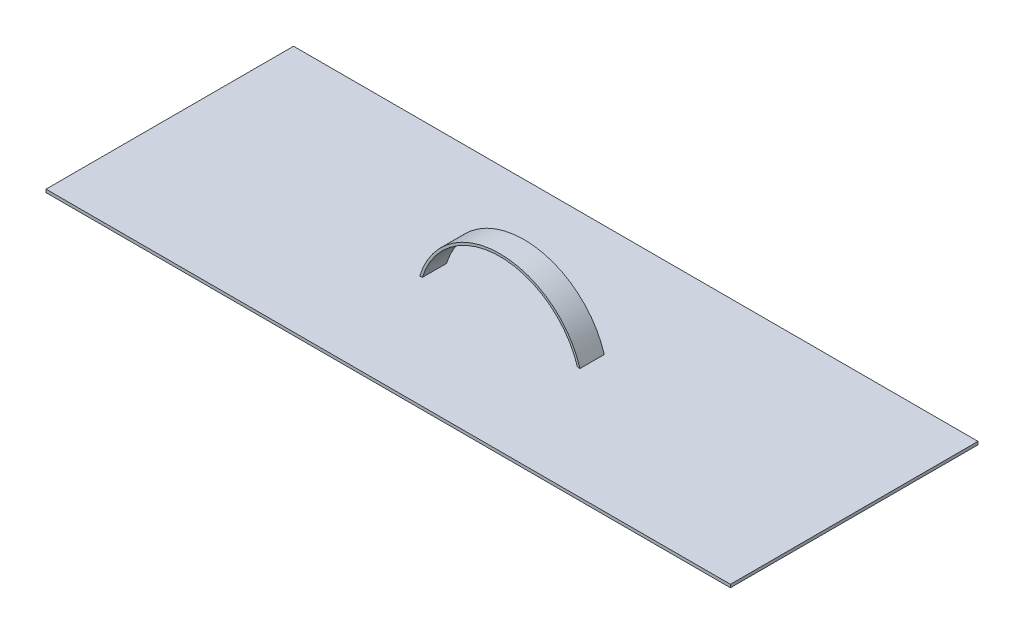
ISO-10303-21;
HEADER;
FILE_DESCRIPTION(('STEP AP214'),'2;1');
FILE_NAME('part.step','',(''),(''),'','','');
FILE_SCHEMA(('AUTOMOTIVE_DESIGN { 1 0 10303 214 1 1 1 1 }'));
ENDSEC;
DATA;
#1=APPLICATION_CONTEXT('core data for automotive mechanical design processes');
#2=APPLICATION_PROTOCOL_DEFINITION('international standard','automotive_design',2000,#1);
#3=PRODUCT_CONTEXT('',#1,'mechanical');
#4=PRODUCT('Part','Part','',(#3));
#5=PRODUCT_RELATED_PRODUCT_CATEGORY('part','',(#4));
#6=PRODUCT_DEFINITION_FORMATION('','',#4);
#7=PRODUCT_DEFINITION_CONTEXT('part definition',#1,'design');
#8=PRODUCT_DEFINITION('design','',#6,#7);
#9=PRODUCT_DEFINITION_SHAPE('','',#8);
#10=(LENGTH_UNIT() NAMED_UNIT(*) SI_UNIT(.MILLI.,.METRE.));
#11=(NAMED_UNIT(*) PLANE_ANGLE_UNIT() SI_UNIT($,.RADIAN.));
#12=(NAMED_UNIT(*) SI_UNIT($,.STERADIAN.) SOLID_ANGLE_UNIT());
#13=UNCERTAINTY_MEASURE_WITH_UNIT(LENGTH_MEASURE(1.E-05),#10,'distance_accuracy_value','');
#14=(GEOMETRIC_REPRESENTATION_CONTEXT(3) GLOBAL_UNCERTAINTY_ASSIGNED_CONTEXT((#13)) GLOBAL_UNIT_ASSIGNED_CONTEXT((#10,
#11,#12)) REPRESENTATION_CONTEXT('',''));
#15=CARTESIAN_POINT('',(0.,0.,0.));
#16=DIRECTION('',(0.,0.,1.));
#17=DIRECTION('',(1.,0.,0.));
#18=AXIS2_PLACEMENT_3D('',#15,#16,#17);
#19=CARTESIAN_POINT('',(0.,2.5,0.));
#20=DIRECTION('',(0.,1.,0.));
#21=DIRECTION('',(0.,0.,1.));
#22=AXIS2_PLACEMENT_3D('',#19,#20,#21);
#23=PLANE('',#22);
#24=DIRECTION('',(0.,0.,-1.));
#25=VECTOR('',#24,1.);
#26=CARTESIAN_POINT('',(85.5226523641972,2.5,35.));
#27=LINE('',#26,#25);
#28=CARTESIAN_POINT('',(85.5226523641972,2.5,35.));
#29=VERTEX_POINT('',#28);
#30=CARTESIAN_POINT('',(85.5226523641972,2.5,25.));
#31=VERTEX_POINT('',#30);
#32=EDGE_CURVE('E253',#29,#31,#27,.T.);
#33=ORIENTED_EDGE('',*,*,#32,.F.);
#34=DIRECTION('',(1.,0.,0.));
#35=VECTOR('',#34,1.);
#36=CARTESIAN_POINT('',(0.,2.5,35.));
#37=LINE('',#36,#35);
#38=CARTESIAN_POINT('',(86.5233290185539,2.5,35.));
#39=VERTEX_POINT('',#38);
#40=EDGE_CURVE('E237',#29,#39,#37,.T.);
#41=ORIENTED_EDGE('',*,*,#40,.T.);
#42=DIRECTION('',(0.,0.,-1.));
#43=VECTOR('',#42,1.);
#44=CARTESIAN_POINT('',(86.5233290185539,2.5,35.));
#45=LINE('',#44,#43);
#46=CARTESIAN_POINT('',(86.5233290185539,2.5,25.));
#47=VERTEX_POINT('',#46);
#48=EDGE_CURVE('E258',#39,#47,#45,.T.);
#49=ORIENTED_EDGE('',*,*,#48,.T.);
#50=DIRECTION('',(1.,0.,0.));
#51=VECTOR('',#50,1.);
#52=CARTESIAN_POINT('',(0.,2.5,25.));
#53=LINE('',#52,#51);
#54=EDGE_CURVE('E248',#31,#47,#53,.T.);
#55=ORIENTED_EDGE('',*,*,#54,.F.);
#56=EDGE_LOOP('',(#33,#41,#49,#55));
#57=FACE_BOUND('',#56,.T.);
#58=DIRECTION('',(-1.,0.,0.));
#59=VECTOR('',#58,1.);
#60=CARTESIAN_POINT('',(251.,2.5,-11.));
#61=LINE('',#60,#59);
#62=CARTESIAN_POINT('',(251.,2.5,-11.));
#63=VERTEX_POINT('',#62);
#64=CARTESIAN_POINT('',(-11.,2.5,-11.));
#65=VERTEX_POINT('',#64);
#66=EDGE_CURVE('E201',#63,#65,#61,.T.);
#67=ORIENTED_EDGE('',*,*,#66,.F.);
#68=DIRECTION('',(0.,0.,-1.));
#69=VECTOR('',#68,1.);
#70=CARTESIAN_POINT('',(251.,2.5,71.));
#71=LINE('',#70,#69);
#72=CARTESIAN_POINT('',(251.,2.5,71.));
#73=VERTEX_POINT('',#72);
#74=EDGE_CURVE('E194',#73,#63,#71,.T.);
#75=ORIENTED_EDGE('',*,*,#74,.F.);
#76=DIRECTION('',(1.,0.,0.));
#77=VECTOR('',#76,1.);
#78=CARTESIAN_POINT('',(-11.,2.5,71.));
#79=LINE('',#78,#77);
#80=CARTESIAN_POINT('',(-11.,2.5,71.));
#81=VERTEX_POINT('',#80);
#82=EDGE_CURVE('E197',#81,#73,#79,.T.);
#83=ORIENTED_EDGE('',*,*,#82,.F.);
#84=DIRECTION('',(0.,0.,1.));
#85=VECTOR('',#84,1.);
#86=CARTESIAN_POINT('',(-11.,2.5,-11.));
#87=LINE('',#86,#85);
#88=EDGE_CURVE('E199',#65,#81,#87,.T.);
#89=ORIENTED_EDGE('',*,*,#88,.F.);
#90=EDGE_LOOP('',(#67,#75,#83,#89));
#91=FACE_BOUND('',#90,.T.);
#92=DIRECTION('',(0.,0.,-1.));
#93=VECTOR('',#92,1.);
#94=CARTESIAN_POINT('',(154.477347635803,2.5,35.));
#95=LINE('',#94,#93);
#96=CARTESIAN_POINT('',(154.477347635803,2.5,25.));
#97=VERTEX_POINT('',#96);
#98=CARTESIAN_POINT('',(154.477347635803,2.5,35.));
#99=VERTEX_POINT('',#98);
#100=EDGE_CURVE('E251',#97,#99,#95,.F.);
#101=ORIENTED_EDGE('',*,*,#100,.F.);
#102=CARTESIAN_POINT('',(153.476670981446,2.5,25.));
#103=VERTEX_POINT('',#102);
#104=EDGE_CURVE('E249',#103,#97,#53,.T.);
#105=ORIENTED_EDGE('',*,*,#104,.F.);
#106=DIRECTION('',(0.,0.,-1.));
#107=VECTOR('',#106,1.);
#108=CARTESIAN_POINT('',(153.476670981446,2.5,35.));
#109=LINE('',#108,#107);
#110=CARTESIAN_POINT('',(153.476670981446,2.5,35.));
#111=VERTEX_POINT('',#110);
#112=EDGE_CURVE('E255',#103,#111,#109,.F.);
#113=ORIENTED_EDGE('',*,*,#112,.T.);
#114=EDGE_CURVE('E245',#111,#99,#37,.T.);
#115=ORIENTED_EDGE('',*,*,#114,.T.);
#116=EDGE_LOOP('',(#101,#105,#113,#115));
#117=FACE_BOUND('',#116,.T.);
#118=ADVANCED_FACE('F33',(#57,#91,#117),#23,.F.);
#119=CARTESIAN_POINT('',(0.,13.75,0.));
#120=DIRECTION('',(0.,-1.,0.));
#121=DIRECTION('',(0.,0.,-1.));
#122=AXIS2_PLACEMENT_3D('',#119,#120,#121);
#123=PLANE('',#122);
#124=DIRECTION('',(0.,0.,-1.));
#125=VECTOR('',#124,1.);
#126=CARTESIAN_POINT('',(153.018933962198,13.75,35.));
#127=LINE('',#126,#125);
#128=CARTESIAN_POINT('',(153.018933962198,13.75,35.));
#129=VERTEX_POINT('',#128);
#130=CARTESIAN_POINT('',(153.018933962198,13.75,25.));
#131=VERTEX_POINT('',#130);
#132=EDGE_CURVE('E169',#129,#131,#127,.T.);
#133=ORIENTED_EDGE('',*,*,#132,.F.);
#134=DIRECTION('',(-1.,0.,0.));
#135=VECTOR('',#134,1.);
#136=CARTESIAN_POINT('',(0.,13.75,35.));
#137=LINE('',#136,#135);
#138=CARTESIAN_POINT('',(151.972644557496,13.75,35.));
#139=VERTEX_POINT('',#138);
#140=EDGE_CURVE('E160',#129,#139,#137,.T.);
#141=ORIENTED_EDGE('',*,*,#140,.T.);
#142=DIRECTION('',(0.,0.,-1.));
#143=VECTOR('',#142,1.);
#144=CARTESIAN_POINT('',(151.972644557496,13.75,35.));
#145=LINE('',#144,#143);
#146=CARTESIAN_POINT('',(151.972644557496,13.75,25.));
#147=VERTEX_POINT('',#146);
#148=EDGE_CURVE('E143',#139,#147,#145,.T.);
#149=ORIENTED_EDGE('',*,*,#148,.T.);
#150=DIRECTION('',(-1.,0.,0.));
#151=VECTOR('',#150,1.);
#152=CARTESIAN_POINT('',(0.,13.75,25.));
#153=LINE('',#152,#151);
#154=EDGE_CURVE('E154',#131,#147,#153,.T.);
#155=ORIENTED_EDGE('',*,*,#154,.F.);
#156=EDGE_LOOP('',(#133,#141,#149,#155));
#157=FACE_BOUND('',#156,.T.);
#158=DIRECTION('',(0.,0.,1.));
#159=VECTOR('',#158,1.);
#160=CARTESIAN_POINT('',(-21.,13.75,81.));
#161=LINE('',#160,#159);
#162=CARTESIAN_POINT('',(-21.,13.75,-21.));
#163=VERTEX_POINT('',#162);
#164=CARTESIAN_POINT('',(-21.,13.75,81.));
#165=VERTEX_POINT('',#164);
#166=EDGE_CURVE('E229',#163,#165,#161,.T.);
#167=ORIENTED_EDGE('',*,*,#166,.T.);
#168=DIRECTION('',(1.,0.,0.));
#169=VECTOR('',#168,1.);
#170=CARTESIAN_POINT('',(-21.,13.75,81.));
#171=LINE('',#170,#169);
#172=CARTESIAN_POINT('',(261.,13.75,81.));
#173=VERTEX_POINT('',#172);
#174=EDGE_CURVE('E241',#165,#173,#171,.T.);
#175=ORIENTED_EDGE('',*,*,#174,.T.);
#176=DIRECTION('',(0.,0.,-1.));
#177=VECTOR('',#176,1.);
#178=CARTESIAN_POINT('',(261.,13.75,81.));
#179=LINE('',#178,#177);
#180=CARTESIAN_POINT('',(261.,13.75,-21.));
#181=VERTEX_POINT('',#180);
#182=EDGE_CURVE('E239',#173,#181,#179,.T.);
#183=ORIENTED_EDGE('',*,*,#182,.T.);
#184=DIRECTION('',(-1.,0.,0.));
#185=VECTOR('',#184,1.);
#186=CARTESIAN_POINT('',(-21.,13.75,-21.));
#187=LINE('',#186,#185);
#188=EDGE_CURVE('E226',#181,#163,#187,.T.);
#189=ORIENTED_EDGE('',*,*,#188,.T.);
#190=EDGE_LOOP('',(#167,#175,#183,#189));
#191=FACE_BOUND('',#190,.T.);
#192=DIRECTION('',(0.,0.,-1.));
#193=VECTOR('',#192,1.);
#194=CARTESIAN_POINT('',(86.9810660378019,13.75,35.));
#195=LINE('',#194,#193);
#196=CARTESIAN_POINT('',(86.9810660378019,13.75,25.));
#197=VERTEX_POINT('',#196);
#198=CARTESIAN_POINT('',(86.9810660378019,13.75,35.));
#199=VERTEX_POINT('',#198);
#200=EDGE_CURVE('E11',#197,#199,#195,.F.);
#201=ORIENTED_EDGE('',*,*,#200,.F.);
#202=CARTESIAN_POINT('',(88.0273554425037,13.75,25.));
#203=VERTEX_POINT('',#202);
#204=EDGE_CURVE('E174',#203,#197,#153,.T.);
#205=ORIENTED_EDGE('',*,*,#204,.F.);
#206=DIRECTION('',(0.,0.,-1.));
#207=VECTOR('',#206,1.);
#208=CARTESIAN_POINT('',(88.0273554425037,13.75,35.));
#209=LINE('',#208,#207);
#210=CARTESIAN_POINT('',(88.0273554425037,13.75,35.));
#211=VERTEX_POINT('',#210);
#212=EDGE_CURVE('E171',#203,#211,#209,.F.);
#213=ORIENTED_EDGE('',*,*,#212,.T.);
#214=EDGE_CURVE('E41',#211,#199,#137,.T.);
#215=ORIENTED_EDGE('',*,*,#214,.T.);
#216=EDGE_LOOP('',(#201,#205,#213,#215));
#217=FACE_BOUND('',#216,.T.);
#218=ADVANCED_FACE('F167',(#157,#191,#217),#123,.F.);
#219=CARTESIAN_POINT('',(251.,12.5,-11.));
#220=DIRECTION('',(0.,0.,1.));
#221=DIRECTION('',(1.,0.,0.));
#222=AXIS2_PLACEMENT_3D('',#219,#220,#221);
#223=PLANE('',#222);
#224=ORIENTED_EDGE('',*,*,#66,.T.);
#225=DIRECTION('',(0.,-1.,0.));
#226=VECTOR('',#225,1.);
#227=CARTESIAN_POINT('',(-11.,12.5,-11.));
#228=LINE('',#227,#226);
#229=CARTESIAN_POINT('',(-11.,12.5,-11.));
#230=VERTEX_POINT('',#229);
#231=EDGE_CURVE('E155',#230,#65,#228,.T.);
#232=ORIENTED_EDGE('',*,*,#231,.F.);
#233=DIRECTION('',(-1.,0.,0.));
#234=VECTOR('',#233,1.);
#235=CARTESIAN_POINT('',(251.,12.5,-11.));
#236=LINE('',#235,#234);
#237=CARTESIAN_POINT('',(251.,12.5,-11.));
#238=VERTEX_POINT('',#237);
#239=EDGE_CURVE('E196',#238,#230,#236,.T.);
#240=ORIENTED_EDGE('',*,*,#239,.F.);
#241=DIRECTION('',(0.,-1.,0.));
#242=VECTOR('',#241,1.);
#243=CARTESIAN_POINT('',(251.,12.5,-11.));
#244=LINE('',#243,#242);
#245=EDGE_CURVE('E190',#238,#63,#244,.T.);
#246=ORIENTED_EDGE('',*,*,#245,.T.);
#247=EDGE_LOOP('',(#224,#232,#240,#246));
#248=FACE_BOUND('',#247,.T.);
#249=ADVANCED_FACE('F35',(#248),#223,.F.);
#250=CARTESIAN_POINT('',(-11.,12.5,-11.));
#251=DIRECTION('',(1.,0.,0.));
#252=DIRECTION('',(0.,0.,-1.));
#253=AXIS2_PLACEMENT_3D('',#250,#251,#252);
#254=PLANE('',#253);
#255=ORIENTED_EDGE('',*,*,#88,.T.);
#256=DIRECTION('',(0.,-1.,0.));
#257=VECTOR('',#256,1.);
#258=CARTESIAN_POINT('',(-11.,12.5,71.));
#259=LINE('',#258,#257);
#260=CARTESIAN_POINT('',(-11.,12.5,71.));
#261=VERTEX_POINT('',#260);
#262=EDGE_CURVE('E184',#261,#81,#259,.T.);
#263=ORIENTED_EDGE('',*,*,#262,.F.);
#264=DIRECTION('',(0.,0.,1.));
#265=VECTOR('',#264,1.);
#266=CARTESIAN_POINT('',(-11.,12.5,-11.));
#267=LINE('',#266,#265);
#268=EDGE_CURVE('E210',#230,#261,#267,.T.);
#269=ORIENTED_EDGE('',*,*,#268,.F.);
#270=ORIENTED_EDGE('',*,*,#231,.T.);
#271=EDGE_LOOP('',(#255,#263,#269,#270));
#272=FACE_BOUND('',#271,.T.);
#273=ADVANCED_FACE('F311',(#272),#254,.F.);
#274=CARTESIAN_POINT('',(-11.,12.5,71.));
#275=DIRECTION('',(0.,0.,-1.));
#276=DIRECTION('',(-1.,0.,0.));
#277=AXIS2_PLACEMENT_3D('',#274,#275,#276);
#278=PLANE('',#277);
#279=ORIENTED_EDGE('',*,*,#82,.T.);
#280=DIRECTION('',(0.,-1.,0.));
#281=VECTOR('',#280,1.);
#282=CARTESIAN_POINT('',(251.,12.5,71.));
#283=LINE('',#282,#281);
#284=CARTESIAN_POINT('',(251.,12.5,71.));
#285=VERTEX_POINT('',#284);
#286=EDGE_CURVE('E187',#285,#73,#283,.T.);
#287=ORIENTED_EDGE('',*,*,#286,.F.);
#288=DIRECTION('',(1.,0.,0.));
#289=VECTOR('',#288,1.);
#290=CARTESIAN_POINT('',(-11.,12.5,71.));
#291=LINE('',#290,#289);
#292=EDGE_CURVE('E207',#261,#285,#291,.T.);
#293=ORIENTED_EDGE('',*,*,#292,.F.);
#294=ORIENTED_EDGE('',*,*,#262,.T.);
#295=EDGE_LOOP('',(#279,#287,#293,#294));
#296=FACE_BOUND('',#295,.T.);
#297=ADVANCED_FACE('F308',(#296),#278,.F.);
#298=CARTESIAN_POINT('',(251.,12.5,71.));
#299=DIRECTION('',(-1.,0.,0.));
#300=DIRECTION('',(0.,0.,1.));
#301=AXIS2_PLACEMENT_3D('',#298,#299,#300);
#302=PLANE('',#301);
#303=ORIENTED_EDGE('',*,*,#74,.T.);
#304=ORIENTED_EDGE('',*,*,#245,.F.);
#305=DIRECTION('',(0.,0.,-1.));
#306=VECTOR('',#305,1.);
#307=CARTESIAN_POINT('',(251.,12.5,71.));
#308=LINE('',#307,#306);
#309=EDGE_CURVE('E193',#285,#238,#308,.T.);
#310=ORIENTED_EDGE('',*,*,#309,.F.);
#311=ORIENTED_EDGE('',*,*,#286,.T.);
#312=EDGE_LOOP('',(#303,#304,#310,#311));
#313=FACE_BOUND('',#312,.T.);
#314=ADVANCED_FACE('F305',(#313),#302,.F.);
#315=CARTESIAN_POINT('',(-21.,13.75,81.));
#316=DIRECTION('',(1.,0.,0.));
#317=DIRECTION('',(0.,0.,-1.));
#318=AXIS2_PLACEMENT_3D('',#315,#316,#317);
#319=PLANE('',#318);
#320=DIRECTION('',(0.,0.,1.));
#321=VECTOR('',#320,1.);
#322=CARTESIAN_POINT('',(-21.,12.5,81.));
#323=LINE('',#322,#321);
#324=CARTESIAN_POINT('',(-21.,12.5,-21.));
#325=VERTEX_POINT('',#324);
#326=CARTESIAN_POINT('',(-21.,12.5,81.));
#327=VERTEX_POINT('',#326);
#328=EDGE_CURVE('E234',#325,#327,#323,.T.);
#329=ORIENTED_EDGE('',*,*,#328,.T.);
#330=DIRECTION('',(0.,-1.,0.));
#331=VECTOR('',#330,1.);
#332=CARTESIAN_POINT('',(-21.,13.75,81.));
#333=LINE('',#332,#331);
#334=EDGE_CURVE('E204',#165,#327,#333,.T.);
#335=ORIENTED_EDGE('',*,*,#334,.F.);
#336=ORIENTED_EDGE('',*,*,#166,.F.);
#337=DIRECTION('',(0.,-1.,0.));
#338=VECTOR('',#337,1.);
#339=CARTESIAN_POINT('',(-21.,13.75,-21.));
#340=LINE('',#339,#338);
#341=EDGE_CURVE('E223',#163,#325,#340,.T.);
#342=ORIENTED_EDGE('',*,*,#341,.T.);
#343=EDGE_LOOP('',(#329,#335,#336,#342));
#344=FACE_BOUND('',#343,.T.);
#345=ADVANCED_FACE('F303',(#344),#319,.F.);
#346=CARTESIAN_POINT('',(-21.,13.75,81.));
#347=DIRECTION('',(0.,0.,-1.));
#348=DIRECTION('',(-1.,0.,0.));
#349=AXIS2_PLACEMENT_3D('',#346,#347,#348);
#350=PLANE('',#349);
#351=DIRECTION('',(1.,0.,0.));
#352=VECTOR('',#351,1.);
#353=CARTESIAN_POINT('',(-21.,12.5,81.));
#354=LINE('',#353,#352);
#355=CARTESIAN_POINT('',(261.,12.5,81.));
#356=VERTEX_POINT('',#355);
#357=EDGE_CURVE('E232',#327,#356,#354,.T.);
#358=ORIENTED_EDGE('',*,*,#357,.T.);
#359=DIRECTION('',(0.,-1.,0.));
#360=VECTOR('',#359,1.);
#361=CARTESIAN_POINT('',(261.,13.75,81.));
#362=LINE('',#361,#360);
#363=EDGE_CURVE('E217',#173,#356,#362,.T.);
#364=ORIENTED_EDGE('',*,*,#363,.F.);
#365=ORIENTED_EDGE('',*,*,#174,.F.);
#366=ORIENTED_EDGE('',*,*,#334,.T.);
#367=EDGE_LOOP('',(#358,#364,#365,#366));
#368=FACE_BOUND('',#367,.T.);
#369=ADVANCED_FACE('F346',(#368),#350,.F.);
#370=CARTESIAN_POINT('',(261.,13.75,81.));
#371=DIRECTION('',(-1.,0.,0.));
#372=DIRECTION('',(0.,0.,1.));
#373=AXIS2_PLACEMENT_3D('',#370,#371,#372);
#374=PLANE('',#373);
#375=DIRECTION('',(0.,0.,-1.));
#376=VECTOR('',#375,1.);
#377=CARTESIAN_POINT('',(261.,12.5,81.));
#378=LINE('',#377,#376);
#379=CARTESIAN_POINT('',(261.,12.5,-21.));
#380=VERTEX_POINT('',#379);
#381=EDGE_CURVE('E230',#356,#380,#378,.T.);
#382=ORIENTED_EDGE('',*,*,#381,.T.);
#383=DIRECTION('',(0.,-1.,0.));
#384=VECTOR('',#383,1.);
#385=CARTESIAN_POINT('',(261.,13.75,-21.));
#386=LINE('',#385,#384);
#387=EDGE_CURVE('E220',#181,#380,#386,.T.);
#388=ORIENTED_EDGE('',*,*,#387,.F.);
#389=ORIENTED_EDGE('',*,*,#182,.F.);
#390=ORIENTED_EDGE('',*,*,#363,.T.);
#391=EDGE_LOOP('',(#382,#388,#389,#390));
#392=FACE_BOUND('',#391,.T.);
#393=ADVANCED_FACE('F343',(#392),#374,.F.);
#394=CARTESIAN_POINT('',(-21.,13.75,-21.));
#395=DIRECTION('',(0.,0.,1.));
#396=DIRECTION('',(1.,0.,0.));
#397=AXIS2_PLACEMENT_3D('',#394,#395,#396);
#398=PLANE('',#397);
#399=DIRECTION('',(-1.,0.,0.));
#400=VECTOR('',#399,1.);
#401=CARTESIAN_POINT('',(-21.,12.5,-21.));
#402=LINE('',#401,#400);
#403=EDGE_CURVE('E227',#380,#325,#402,.T.);
#404=ORIENTED_EDGE('',*,*,#403,.T.);
#405=ORIENTED_EDGE('',*,*,#341,.F.);
#406=ORIENTED_EDGE('',*,*,#188,.F.);
#407=ORIENTED_EDGE('',*,*,#387,.T.);
#408=EDGE_LOOP('',(#404,#405,#406,#407));
#409=FACE_BOUND('',#408,.T.);
#410=ADVANCED_FACE('F329',(#409),#398,.F.);
#411=CARTESIAN_POINT('',(0.,12.5,0.));
#412=DIRECTION('',(0.,-1.,0.));
#413=DIRECTION('',(0.,0.,-1.));
#414=AXIS2_PLACEMENT_3D('',#411,#412,#413);
#415=PLANE('',#414);
#416=ORIENTED_EDGE('',*,*,#309,.T.);
#417=ORIENTED_EDGE('',*,*,#239,.T.);
#418=ORIENTED_EDGE('',*,*,#268,.T.);
#419=ORIENTED_EDGE('',*,*,#292,.T.);
#420=EDGE_LOOP('',(#416,#417,#418,#419));
#421=FACE_BOUND('',#420,.T.);
#422=ORIENTED_EDGE('',*,*,#328,.F.);
#423=ORIENTED_EDGE('',*,*,#403,.F.);
#424=ORIENTED_EDGE('',*,*,#381,.F.);
#425=ORIENTED_EDGE('',*,*,#357,.F.);
#426=EDGE_LOOP('',(#422,#423,#424,#425));
#427=FACE_BOUND('',#426,.T.);
#428=ADVANCED_FACE('F294',(#421,#427),#415,.T.);
#429=CARTESIAN_POINT('',(120.,3.75,35.));
#430=DIRECTION('',(0.,0.,-1.));
#431=DIRECTION('',(-1.,0.,0.));
#432=AXIS2_PLACEMENT_3D('',#429,#430,#431);
#433=CYLINDRICAL_SURFACE('',#432,33.5);
#434=ORIENTED_EDGE('',*,*,#212,.F.);
#435=CARTESIAN_POINT('',(120.,3.75,25.));
#436=DIRECTION('',(0.,0.,1.));
#437=DIRECTION('',(1.,0.,0.));
#438=AXIS2_PLACEMENT_3D('',#435,#436,#437);
#439=CIRCLE('',#438,33.5);
#440=EDGE_CURVE('E149',#147,#203,#439,.T.);
#441=ORIENTED_EDGE('',*,*,#440,.F.);
#442=ORIENTED_EDGE('',*,*,#148,.F.);
#443=CARTESIAN_POINT('',(120.,3.75,35.));
#444=DIRECTION('',(0.,0.,1.));
#445=DIRECTION('',(1.,0.,0.));
#446=AXIS2_PLACEMENT_3D('',#443,#444,#445);
#447=CIRCLE('',#446,33.5);
#448=EDGE_CURVE('E146',#139,#211,#447,.T.);
#449=ORIENTED_EDGE('',*,*,#448,.T.);
#450=EDGE_LOOP('',(#434,#441,#442,#449));
#451=FACE_BOUND('',#450,.T.);
#452=ADVANCED_FACE('F145',(#451),#433,.F.);
#453=CARTESIAN_POINT('',(120.,3.75,35.));
#454=DIRECTION('',(0.,0.,-1.));
#455=DIRECTION('',(-1.,0.,0.));
#456=AXIS2_PLACEMENT_3D('',#453,#454,#455);
#457=CYLINDRICAL_SURFACE('',#456,34.5);
#458=CARTESIAN_POINT('',(120.,3.75,25.));
#459=DIRECTION('',(0.,0.,1.));
#460=DIRECTION('',(1.,0.,0.));
#461=AXIS2_PLACEMENT_3D('',#458,#459,#460);
#462=CIRCLE('',#461,34.5);
#463=EDGE_CURVE('E262',#131,#197,#462,.T.);
#464=ORIENTED_EDGE('',*,*,#463,.T.);
#465=ORIENTED_EDGE('',*,*,#200,.T.);
#466=CARTESIAN_POINT('',(120.,3.75,35.));
#467=DIRECTION('',(0.,0.,1.));
#468=DIRECTION('',(1.,0.,0.));
#469=AXIS2_PLACEMENT_3D('',#466,#467,#468);
#470=CIRCLE('',#469,34.5);
#471=EDGE_CURVE('E261',#129,#199,#470,.T.);
#472=ORIENTED_EDGE('',*,*,#471,.F.);
#473=ORIENTED_EDGE('',*,*,#132,.T.);
#474=EDGE_LOOP('',(#464,#465,#472,#473));
#475=FACE_BOUND('',#474,.T.);
#476=ADVANCED_FACE('F291',(#475),#457,.T.);
#477=CARTESIAN_POINT('',(120.,3.75,25.));
#478=DIRECTION('',(0.,0.,1.));
#479=DIRECTION('',(1.,0.,0.));
#480=AXIS2_PLACEMENT_3D('',#477,#478,#479);
#481=PLANE('',#480);
#482=ORIENTED_EDGE('',*,*,#463,.F.);
#483=ORIENTED_EDGE('',*,*,#154,.T.);
#484=ORIENTED_EDGE('',*,*,#440,.T.);
#485=ORIENTED_EDGE('',*,*,#204,.T.);
#486=EDGE_LOOP('',(#482,#483,#484,#485));
#487=FACE_BOUND('',#486,.T.);
#488=ADVANCED_FACE('F348',(#487),#481,.F.);
#489=CARTESIAN_POINT('',(120.,3.75,35.));
#490=DIRECTION('',(0.,0.,1.));
#491=DIRECTION('',(1.,0.,0.));
#492=AXIS2_PLACEMENT_3D('',#489,#490,#491);
#493=PLANE('',#492);
#494=ORIENTED_EDGE('',*,*,#140,.F.);
#495=ORIENTED_EDGE('',*,*,#471,.T.);
#496=ORIENTED_EDGE('',*,*,#214,.F.);
#497=ORIENTED_EDGE('',*,*,#448,.F.);
#498=EDGE_LOOP('',(#494,#495,#496,#497));
#499=FACE_BOUND('',#498,.T.);
#500=ADVANCED_FACE('F158',(#499),#493,.T.);
#501=ORIENTED_EDGE('',*,*,#40,.F.);
#502=EDGE_CURVE('E264',#29,#99,#470,.T.);
#503=ORIENTED_EDGE('',*,*,#502,.T.);
#504=ORIENTED_EDGE('',*,*,#114,.F.);
#505=EDGE_CURVE('E48',#39,#111,#447,.T.);
#506=ORIENTED_EDGE('',*,*,#505,.F.);
#507=EDGE_LOOP('',(#501,#503,#504,#506));
#508=FACE_BOUND('',#507,.T.);
#509=ADVANCED_FACE('F280',(#508),#493,.T.);
#510=EDGE_CURVE('E164',#31,#97,#462,.T.);
#511=ORIENTED_EDGE('',*,*,#510,.F.);
#512=ORIENTED_EDGE('',*,*,#54,.T.);
#513=EDGE_CURVE('E53',#47,#103,#439,.T.);
#514=ORIENTED_EDGE('',*,*,#513,.T.);
#515=ORIENTED_EDGE('',*,*,#104,.T.);
#516=EDGE_LOOP('',(#511,#512,#514,#515));
#517=FACE_BOUND('',#516,.T.);
#518=ADVANCED_FACE('F269',(#517),#481,.F.);
#519=ORIENTED_EDGE('',*,*,#510,.T.);
#520=ORIENTED_EDGE('',*,*,#100,.T.);
#521=ORIENTED_EDGE('',*,*,#502,.F.);
#522=ORIENTED_EDGE('',*,*,#32,.T.);
#523=EDGE_LOOP('',(#519,#520,#521,#522));
#524=FACE_BOUND('',#523,.T.);
#525=ADVANCED_FACE('F277',(#524),#457,.T.);
#526=ORIENTED_EDGE('',*,*,#112,.F.);
#527=ORIENTED_EDGE('',*,*,#513,.F.);
#528=ORIENTED_EDGE('',*,*,#48,.F.);
#529=ORIENTED_EDGE('',*,*,#505,.T.);
#530=EDGE_LOOP('',(#526,#527,#528,#529));
#531=FACE_BOUND('',#530,.T.);
#532=ADVANCED_FACE('F284',(#531),#433,.F.);
#533=CLOSED_SHELL('',(#118,#218,#249,#273,#297,#314,#345,#369,#393,#410,#428,#452,#476,#488,
#500,#509,#518,#525,#532));
#534=MANIFOLD_SOLID_BREP('B2',#533);
#535=ADVANCED_BREP_SHAPE_REPRESENTATION('',(#18,#534),#14);
#536=SHAPE_DEFINITION_REPRESENTATION(#9,#535);
ENDSEC;
END-ISO-10303-21;
